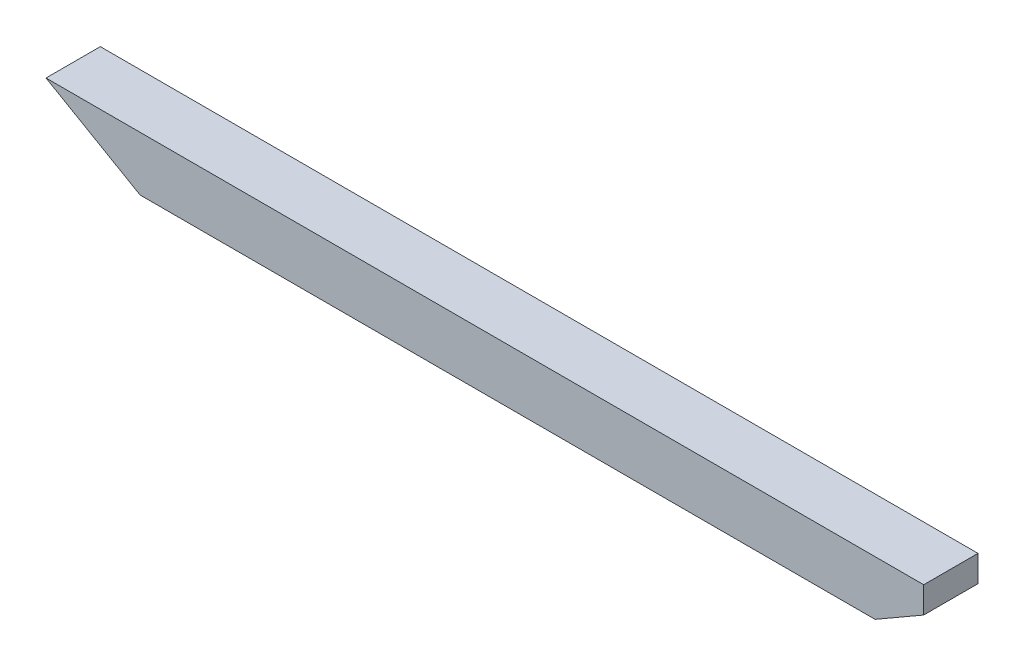
ISO-10303-21;
HEADER;
FILE_DESCRIPTION(('STEP AP214'),'2;1');
FILE_NAME('part.step','',(''),(''),'','','');
FILE_SCHEMA(('AUTOMOTIVE_DESIGN { 1 0 10303 214 1 1 1 1 }'));
ENDSEC;
DATA;
#1=APPLICATION_CONTEXT('core data for automotive mechanical design processes');
#2=APPLICATION_PROTOCOL_DEFINITION('international standard','automotive_design',2000,#1);
#3=PRODUCT_CONTEXT('',#1,'mechanical');
#4=PRODUCT('Part','Part','',(#3));
#5=PRODUCT_RELATED_PRODUCT_CATEGORY('part','',(#4));
#6=PRODUCT_DEFINITION_FORMATION('','',#4);
#7=PRODUCT_DEFINITION_CONTEXT('part definition',#1,'design');
#8=PRODUCT_DEFINITION('design','',#6,#7);
#9=PRODUCT_DEFINITION_SHAPE('','',#8);
#10=(LENGTH_UNIT() NAMED_UNIT(*) SI_UNIT(.MILLI.,.METRE.));
#11=(NAMED_UNIT(*) PLANE_ANGLE_UNIT() SI_UNIT($,.RADIAN.));
#12=(NAMED_UNIT(*) SI_UNIT($,.STERADIAN.) SOLID_ANGLE_UNIT());
#13=UNCERTAINTY_MEASURE_WITH_UNIT(LENGTH_MEASURE(1.E-05),#10,'distance_accuracy_value','');
#14=(GEOMETRIC_REPRESENTATION_CONTEXT(3) GLOBAL_UNCERTAINTY_ASSIGNED_CONTEXT((#13)) GLOBAL_UNIT_ASSIGNED_CONTEXT((#10,
#11,#12)) REPRESENTATION_CONTEXT('',''));
#15=CARTESIAN_POINT('',(0.,0.,0.));
#16=DIRECTION('',(0.,0.,1.));
#17=DIRECTION('',(1.,0.,0.));
#18=AXIS2_PLACEMENT_3D('',#15,#16,#17);
#19=CARTESIAN_POINT('',(-148.954599838897,14.3842513847783,20.));
#20=DIRECTION('',(0.499966704293491,0.86604462621617,0.));
#21=DIRECTION('',(-0.86604462621617,0.499966704293491,0.));
#22=AXIS2_PLACEMENT_3D('',#19,#20,#21);
#23=PLANE('',#22);
#24=DIRECTION('',(0.86604462621617,-0.499966704293491,0.));
#25=VECTOR('',#24,1.);
#26=CARTESIAN_POINT('',(-148.954599838897,14.3842513847783,0.));
#27=LINE('',#26,#25);
#28=CARTESIAN_POINT('',(-183.598691886586,34.3842513847783,0.));
#29=VERTEX_POINT('',#28);
#30=CARTESIAN_POINT('',(-148.954599838897,14.3842513847783,0.));
#31=VERTEX_POINT('',#30);
#32=EDGE_CURVE('E108',#29,#31,#27,.T.);
#33=ORIENTED_EDGE('',*,*,#32,.T.);
#34=DIRECTION('',(0.,0.,-1.));
#35=VECTOR('',#34,1.);
#36=CARTESIAN_POINT('',(-148.954599838897,14.3842513847783,20.));
#37=LINE('',#36,#35);
#38=CARTESIAN_POINT('',(-148.954599838897,14.3842513847783,20.));
#39=VERTEX_POINT('',#38);
#40=EDGE_CURVE('E11',#39,#31,#37,.T.);
#41=ORIENTED_EDGE('',*,*,#40,.F.);
#42=DIRECTION('',(0.86604462621617,-0.499966704293491,0.));
#43=VECTOR('',#42,1.);
#44=CARTESIAN_POINT('',(-148.954599838897,14.3842513847783,20.));
#45=LINE('',#44,#43);
#46=CARTESIAN_POINT('',(-183.598691886586,34.3842513847783,20.));
#47=VERTEX_POINT('',#46);
#48=EDGE_CURVE('E117',#47,#39,#45,.T.);
#49=ORIENTED_EDGE('',*,*,#48,.F.);
#50=DIRECTION('',(0.,0.,-1.));
#51=VECTOR('',#50,1.);
#52=CARTESIAN_POINT('',(-183.598691886586,34.3842513847783,20.));
#53=LINE('',#52,#51);
#54=EDGE_CURVE('E104',#47,#29,#53,.T.);
#55=ORIENTED_EDGE('',*,*,#54,.T.);
#56=EDGE_LOOP('',(#33,#41,#49,#55));
#57=FACE_BOUND('',#56,.T.);
#58=ADVANCED_FACE('F33',(#57),#23,.F.);
#59=CARTESIAN_POINT('',(121.665400161103,14.3842513847784,20.));
#60=DIRECTION('',(0.,1.,0.));
#61=DIRECTION('',(-1.,0.,0.));
#62=AXIS2_PLACEMENT_3D('',#59,#60,#61);
#63=PLANE('',#62);
#64=DIRECTION('',(1.,0.,0.));
#65=VECTOR('',#64,1.);
#66=CARTESIAN_POINT('',(121.665400161103,14.3842513847784,0.));
#67=LINE('',#66,#65);
#68=CARTESIAN_POINT('',(121.665400161103,14.3842513847784,0.));
#69=VERTEX_POINT('',#68);
#70=EDGE_CURVE('E111',#31,#69,#67,.T.);
#71=ORIENTED_EDGE('',*,*,#70,.T.);
#72=DIRECTION('',(0.,0.,-1.));
#73=VECTOR('',#72,1.);
#74=CARTESIAN_POINT('',(121.665400161103,14.3842513847784,20.));
#75=LINE('',#74,#73);
#76=CARTESIAN_POINT('',(121.665400161103,14.3842513847784,20.));
#77=VERTEX_POINT('',#76);
#78=EDGE_CURVE('E41',#77,#69,#75,.T.);
#79=ORIENTED_EDGE('',*,*,#78,.F.);
#80=DIRECTION('',(1.,0.,0.));
#81=VECTOR('',#80,1.);
#82=CARTESIAN_POINT('',(121.665400161103,14.3842513847784,20.));
#83=LINE('',#82,#81);
#84=EDGE_CURVE('E81',#39,#77,#83,.T.);
#85=ORIENTED_EDGE('',*,*,#84,.F.);
#86=ORIENTED_EDGE('',*,*,#40,.T.);
#87=EDGE_LOOP('',(#71,#79,#85,#86));
#88=FACE_BOUND('',#87,.T.);
#89=ADVANCED_FACE('F125',(#88),#63,.F.);
#90=CARTESIAN_POINT('',(121.665400161103,14.3842513847784,20.));
#91=DIRECTION('',(-0.499834152157346,0.866121134909631,0.));
#92=DIRECTION('',(-0.866121134909631,-0.499834152157346,0.));
#93=AXIS2_PLACEMENT_3D('',#90,#91,#92);
#94=PLANE('',#93);
#95=DIRECTION('',(0.866121134909631,0.499834152157346,0.));
#96=VECTOR('',#95,1.);
#97=CARTESIAN_POINT('',(121.665400161103,14.3842513847784,0.));
#98=LINE('',#97,#96);
#99=CARTESIAN_POINT('',(139.565400161103,24.7142513847784,0.));
#100=VERTEX_POINT('',#99);
#101=EDGE_CURVE('E98',#69,#100,#98,.T.);
#102=ORIENTED_EDGE('',*,*,#101,.T.);
#103=DIRECTION('',(0.,0.,-1.));
#104=VECTOR('',#103,1.);
#105=CARTESIAN_POINT('',(139.565400161103,24.7142513847784,20.));
#106=LINE('',#105,#104);
#107=CARTESIAN_POINT('',(139.565400161103,24.7142513847784,20.));
#108=VERTEX_POINT('',#107);
#109=EDGE_CURVE('E95',#108,#100,#106,.T.);
#110=ORIENTED_EDGE('',*,*,#109,.F.);
#111=DIRECTION('',(0.866121134909631,0.499834152157346,0.));
#112=VECTOR('',#111,1.);
#113=CARTESIAN_POINT('',(121.665400161103,14.3842513847784,20.));
#114=LINE('',#113,#112);
#115=EDGE_CURVE('E85',#77,#108,#114,.T.);
#116=ORIENTED_EDGE('',*,*,#115,.F.);
#117=ORIENTED_EDGE('',*,*,#78,.T.);
#118=EDGE_LOOP('',(#102,#110,#116,#117));
#119=FACE_BOUND('',#118,.T.);
#120=ADVANCED_FACE('F96',(#119),#94,.F.);
#121=CARTESIAN_POINT('',(139.565400161103,34.3842513847783,20.));
#122=DIRECTION('',(-1.,0.,0.));
#123=DIRECTION('',(0.,0.,1.));
#124=AXIS2_PLACEMENT_3D('',#121,#122,#123);
#125=PLANE('',#124);
#126=DIRECTION('',(0.,1.,0.));
#127=VECTOR('',#126,1.);
#128=CARTESIAN_POINT('',(139.565400161103,34.3842513847783,0.));
#129=LINE('',#128,#127);
#130=CARTESIAN_POINT('',(139.565400161103,34.3842513847783,0.));
#131=VERTEX_POINT('',#130);
#132=EDGE_CURVE('E114',#100,#131,#129,.T.);
#133=ORIENTED_EDGE('',*,*,#132,.T.);
#134=DIRECTION('',(0.,0.,-1.));
#135=VECTOR('',#134,1.);
#136=CARTESIAN_POINT('',(139.565400161103,34.3842513847783,20.));
#137=LINE('',#136,#135);
#138=CARTESIAN_POINT('',(139.565400161103,34.3842513847783,20.));
#139=VERTEX_POINT('',#138);
#140=EDGE_CURVE('E100',#139,#131,#137,.T.);
#141=ORIENTED_EDGE('',*,*,#140,.F.);
#142=DIRECTION('',(0.,1.,0.));
#143=VECTOR('',#142,1.);
#144=CARTESIAN_POINT('',(139.565400161103,34.3842513847783,20.));
#145=LINE('',#144,#143);
#146=EDGE_CURVE('E89',#108,#139,#145,.T.);
#147=ORIENTED_EDGE('',*,*,#146,.F.);
#148=ORIENTED_EDGE('',*,*,#109,.T.);
#149=EDGE_LOOP('',(#133,#141,#147,#148));
#150=FACE_BOUND('',#149,.T.);
#151=ADVANCED_FACE('F102',(#150),#125,.F.);
#152=CARTESIAN_POINT('',(-183.598691886586,34.3842513847783,20.));
#153=DIRECTION('',(0.,-1.,0.));
#154=DIRECTION('',(0.,0.,-1.));
#155=AXIS2_PLACEMENT_3D('',#152,#153,#154);
#156=PLANE('',#155);
#157=DIRECTION('',(-1.,0.,0.));
#158=VECTOR('',#157,1.);
#159=CARTESIAN_POINT('',(-183.598691886586,34.3842513847783,0.));
#160=LINE('',#159,#158);
#161=EDGE_CURVE('E69',#131,#29,#160,.T.);
#162=ORIENTED_EDGE('',*,*,#161,.T.);
#163=ORIENTED_EDGE('',*,*,#54,.F.);
#164=DIRECTION('',(-1.,0.,0.));
#165=VECTOR('',#164,1.);
#166=CARTESIAN_POINT('',(121.665400161103,34.3842513847783,20.));
#167=LINE('',#166,#165);
#168=EDGE_CURVE('E49',#139,#47,#167,.T.);
#169=ORIENTED_EDGE('',*,*,#168,.F.);
#170=ORIENTED_EDGE('',*,*,#140,.T.);
#171=EDGE_LOOP('',(#162,#163,#169,#170));
#172=FACE_BOUND('',#171,.T.);
#173=ADVANCED_FACE('F120',(#172),#156,.F.);
#174=CARTESIAN_POINT('',(0.,0.,20.));
#175=DIRECTION('',(0.,0.,1.));
#176=DIRECTION('',(1.,0.,0.));
#177=AXIS2_PLACEMENT_3D('',#174,#175,#176);
#178=PLANE('',#177);
#179=ORIENTED_EDGE('',*,*,#48,.T.);
#180=ORIENTED_EDGE('',*,*,#84,.T.);
#181=ORIENTED_EDGE('',*,*,#115,.T.);
#182=ORIENTED_EDGE('',*,*,#146,.T.);
#183=ORIENTED_EDGE('',*,*,#168,.T.);
#184=EDGE_LOOP('',(#179,#180,#181,#182,#183));
#185=FACE_BOUND('',#184,.T.);
#186=ADVANCED_FACE('F87',(#185),#178,.T.);
#187=CARTESIAN_POINT('',(0.,0.,0.));
#188=DIRECTION('',(0.,0.,1.));
#189=DIRECTION('',(1.,0.,0.));
#190=AXIS2_PLACEMENT_3D('',#187,#188,#189);
#191=PLANE('',#190);
#192=ORIENTED_EDGE('',*,*,#32,.F.);
#193=ORIENTED_EDGE('',*,*,#161,.F.);
#194=ORIENTED_EDGE('',*,*,#132,.F.);
#195=ORIENTED_EDGE('',*,*,#101,.F.);
#196=ORIENTED_EDGE('',*,*,#70,.F.);
#197=EDGE_LOOP('',(#192,#193,#194,#195,#196));
#198=FACE_BOUND('',#197,.T.);
#199=ADVANCED_FACE('F119',(#198),#191,.F.);
#200=CLOSED_SHELL('',(#58,#89,#120,#151,#173,#186,#199));
#201=MANIFOLD_SOLID_BREP('B2',#200);
#202=ADVANCED_BREP_SHAPE_REPRESENTATION('',(#18,#201),#14);
#203=SHAPE_DEFINITION_REPRESENTATION(#9,#202);
ENDSEC;
END-ISO-10303-21;
